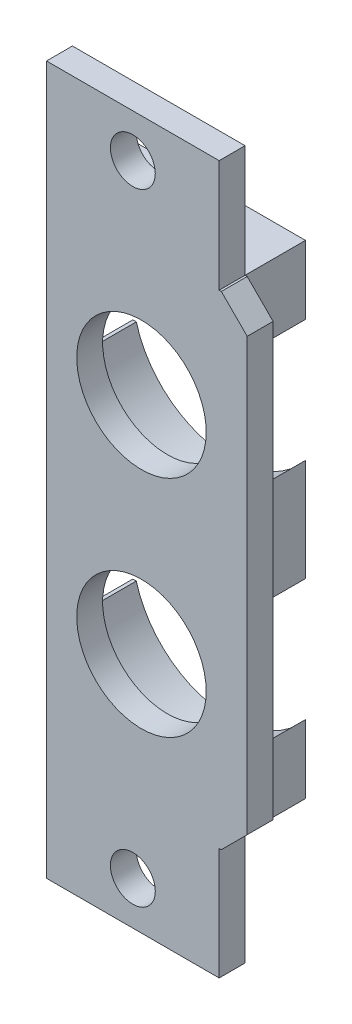
ISO-10303-21;
HEADER;
FILE_DESCRIPTION(('STEP AP214'),'2;1');
FILE_NAME('part.step','',(''),(''),'','','');
FILE_SCHEMA(('AUTOMOTIVE_DESIGN { 1 0 10303 214 1 1 1 1 }'));
ENDSEC;
DATA;
#1=APPLICATION_CONTEXT('core data for automotive mechanical design processes');
#2=APPLICATION_PROTOCOL_DEFINITION('international standard','automotive_design',2000,#1);
#3=PRODUCT_CONTEXT('',#1,'mechanical');
#4=PRODUCT('Part','Part','',(#3));
#5=PRODUCT_RELATED_PRODUCT_CATEGORY('part','',(#4));
#6=PRODUCT_DEFINITION_FORMATION('','',#4);
#7=PRODUCT_DEFINITION_CONTEXT('part definition',#1,'design');
#8=PRODUCT_DEFINITION('design','',#6,#7);
#9=PRODUCT_DEFINITION_SHAPE('','',#8);
#10=(LENGTH_UNIT() NAMED_UNIT(*) SI_UNIT(.MILLI.,.METRE.));
#11=(NAMED_UNIT(*) PLANE_ANGLE_UNIT() SI_UNIT($,.RADIAN.));
#12=(NAMED_UNIT(*) SI_UNIT($,.STERADIAN.) SOLID_ANGLE_UNIT());
#13=UNCERTAINTY_MEASURE_WITH_UNIT(LENGTH_MEASURE(1.E-05),#10,'distance_accuracy_value','');
#14=(GEOMETRIC_REPRESENTATION_CONTEXT(3) GLOBAL_UNCERTAINTY_ASSIGNED_CONTEXT((#13)) GLOBAL_UNIT_ASSIGNED_CONTEXT((#10,
#11,#12)) REPRESENTATION_CONTEXT('',''));
#15=CARTESIAN_POINT('',(0.,0.,0.));
#16=DIRECTION('',(0.,0.,1.));
#17=DIRECTION('',(1.,0.,0.));
#18=AXIS2_PLACEMENT_3D('',#15,#16,#17);
#19=CARTESIAN_POINT('',(10.,0.,-3.));
#20=DIRECTION('',(1.,0.,0.));
#21=DIRECTION('',(0.,0.,-1.));
#22=AXIS2_PLACEMENT_3D('',#19,#20,#21);
#23=PLANE('',#22);
#24=DIRECTION('',(0.,1.,0.));
#25=VECTOR('',#24,1.);
#26=CARTESIAN_POINT('',(10.,28.,-3.));
#27=LINE('',#26,#25);
#28=CARTESIAN_POINT('',(10.,-5.92893218813449,-3.));
#29=VERTEX_POINT('',#28);
#30=CARTESIAN_POINT('',(10.,5.92893218813454,-3.));
#31=VERTEX_POINT('',#30);
#32=EDGE_CURVE('E269',#29,#31,#27,.T.);
#33=ORIENTED_EDGE('',*,*,#32,.F.);
#34=DIRECTION('',(0.,0.,1.));
#35=VECTOR('',#34,1.);
#36=CARTESIAN_POINT('',(10.,-5.92893218813452,-45.322178059884));
#37=LINE('',#36,#35);
#38=CARTESIAN_POINT('',(10.,-5.92893218813452,-10.));
#39=VERTEX_POINT('',#38);
#40=EDGE_CURVE('E384',#39,#29,#37,.T.);
#41=ORIENTED_EDGE('',*,*,#40,.F.);
#42=DIRECTION('',(0.,1.,0.));
#43=VECTOR('',#42,1.);
#44=CARTESIAN_POINT('',(10.,0.,-10.));
#45=LINE('',#44,#43);
#46=CARTESIAN_POINT('',(9.99999999999999,5.92893218813453,-10.));
#47=VERTEX_POINT('',#46);
#48=EDGE_CURVE('E375',#39,#47,#45,.T.);
#49=ORIENTED_EDGE('',*,*,#48,.T.);
#50=DIRECTION('',(0.,0.,1.));
#51=VECTOR('',#50,1.);
#52=CARTESIAN_POINT('',(9.99999999999999,5.92893218813453,-45.322178059884));
#53=LINE('',#52,#51);
#54=EDGE_CURVE('E369',#47,#31,#53,.T.);
#55=ORIENTED_EDGE('',*,*,#54,.T.);
#56=EDGE_LOOP('',(#33,#41,#49,#55));
#57=FACE_BOUND('',#56,.T.);
#58=ADVANCED_FACE('F41',(#57),#23,.T.);
#59=CARTESIAN_POINT('',(9.99999999999999,-28.,-3.));
#60=VERTEX_POINT('',#59);
#61=CARTESIAN_POINT('',(10.,-20.0710678118654,-3.));
#62=VERTEX_POINT('',#61);
#63=EDGE_CURVE('E283',#60,#62,#27,.T.);
#64=ORIENTED_EDGE('',*,*,#63,.F.);
#65=DIRECTION('',(0.,0.,1.));
#66=VECTOR('',#65,1.);
#67=CARTESIAN_POINT('',(10.,-28.,-45.322178059884));
#68=LINE('',#67,#66);
#69=CARTESIAN_POINT('',(10.,-28.,-10.));
#70=VERTEX_POINT('',#69);
#71=EDGE_CURVE('E307',#70,#60,#68,.T.);
#72=ORIENTED_EDGE('',*,*,#71,.F.);
#73=DIRECTION('',(0.,1.,0.));
#74=VECTOR('',#73,1.);
#75=CARTESIAN_POINT('',(9.99999999999999,0.,-10.));
#76=LINE('',#75,#74);
#77=CARTESIAN_POINT('',(10.,-20.0710678118655,-10.));
#78=VERTEX_POINT('',#77);
#79=EDGE_CURVE('E298',#70,#78,#76,.T.);
#80=ORIENTED_EDGE('',*,*,#79,.T.);
#81=DIRECTION('',(0.,0.,1.));
#82=VECTOR('',#81,1.);
#83=CARTESIAN_POINT('',(10.,-20.0710678118655,-45.322178059884));
#84=LINE('',#83,#82);
#85=EDGE_CURVE('E296',#78,#62,#84,.T.);
#86=ORIENTED_EDGE('',*,*,#85,.T.);
#87=EDGE_LOOP('',(#64,#72,#80,#86));
#88=FACE_BOUND('',#87,.T.);
#89=ADVANCED_FACE('F504',(#88),#23,.T.);
#90=DIRECTION('',(0.,0.,-1.));
#91=VECTOR('',#90,1.);
#92=CARTESIAN_POINT('',(9.99999999999999,-28.,0.));
#93=LINE('',#92,#91);
#94=CARTESIAN_POINT('',(9.99999999999999,-28.,0.));
#95=VERTEX_POINT('',#94);
#96=EDGE_CURVE('E217',#95,#60,#93,.T.);
#97=ORIENTED_EDGE('',*,*,#96,.F.);
#98=DIRECTION('',(0.,1.,0.));
#99=VECTOR('',#98,1.);
#100=CARTESIAN_POINT('',(10.,0.,0.));
#101=LINE('',#100,#99);
#102=CARTESIAN_POINT('',(10.,-41.,0.));
#103=VERTEX_POINT('',#102);
#104=EDGE_CURVE('E234',#103,#95,#101,.T.);
#105=ORIENTED_EDGE('',*,*,#104,.F.);
#106=DIRECTION('',(0.,0.,1.));
#107=VECTOR('',#106,1.);
#108=CARTESIAN_POINT('',(10.,-41.,-3.));
#109=LINE('',#108,#107);
#110=CARTESIAN_POINT('',(10.,-41.,-3.));
#111=VERTEX_POINT('',#110);
#112=EDGE_CURVE('E259',#111,#103,#109,.T.);
#113=ORIENTED_EDGE('',*,*,#112,.F.);
#114=DIRECTION('',(0.,1.,0.));
#115=VECTOR('',#114,1.);
#116=CARTESIAN_POINT('',(10.,0.,-3.));
#117=LINE('',#116,#115);
#118=EDGE_CURVE('E421',#111,#60,#117,.T.);
#119=ORIENTED_EDGE('',*,*,#118,.T.);
#120=EDGE_LOOP('',(#97,#105,#113,#119));
#121=FACE_BOUND('',#120,.T.);
#122=ADVANCED_FACE('F509',(#121),#23,.T.);
#123=CARTESIAN_POINT('',(10.,28.,0.));
#124=VERTEX_POINT('',#123);
#125=CARTESIAN_POINT('',(10.,41.,0.));
#126=VERTEX_POINT('',#125);
#127=EDGE_CURVE('E224',#124,#126,#101,.T.);
#128=ORIENTED_EDGE('',*,*,#127,.F.);
#129=DIRECTION('',(0.,0.,-1.));
#130=VECTOR('',#129,1.);
#131=CARTESIAN_POINT('',(10.,28.,0.));
#132=LINE('',#131,#130);
#133=CARTESIAN_POINT('',(10.,28.,-3.));
#134=VERTEX_POINT('',#133);
#135=EDGE_CURVE('E206',#124,#134,#132,.T.);
#136=ORIENTED_EDGE('',*,*,#135,.T.);
#137=CARTESIAN_POINT('',(10.,41.,-3.));
#138=VERTEX_POINT('',#137);
#139=EDGE_CURVE('E420',#134,#138,#117,.T.);
#140=ORIENTED_EDGE('',*,*,#139,.T.);
#141=DIRECTION('',(0.,0.,1.));
#142=VECTOR('',#141,1.);
#143=CARTESIAN_POINT('',(10.,41.,-3.));
#144=LINE('',#143,#142);
#145=EDGE_CURVE('E232',#138,#126,#144,.T.);
#146=ORIENTED_EDGE('',*,*,#145,.T.);
#147=EDGE_LOOP('',(#128,#136,#140,#146));
#148=FACE_BOUND('',#147,.T.);
#149=ADVANCED_FACE('F230',(#148),#23,.T.);
#150=CARTESIAN_POINT('',(0.,0.,-3.));
#151=DIRECTION('',(0.,0.,1.));
#152=DIRECTION('',(1.,0.,0.));
#153=AXIS2_PLACEMENT_3D('',#150,#151,#152);
#154=PLANE('',#153);
#155=CARTESIAN_POINT('',(0.,36.,-3.));
#156=DIRECTION('',(0.,0.,1.));
#157=DIRECTION('',(1.,0.,0.));
#158=AXIS2_PLACEMENT_3D('',#155,#156,#157);
#159=CIRCLE('',#158,2.6);
#160=CARTESIAN_POINT('',(2.59999999999999,36.,-3.));
#161=VERTEX_POINT('',#160);
#162=EDGE_CURVE('E253',#161,#161,#159,.T.);
#163=ORIENTED_EDGE('',*,*,#162,.T.);
#164=EDGE_LOOP('',(#163));
#165=FACE_BOUND('',#164,.T.);
#166=DIRECTION('',(1.,0.,0.));
#167=VECTOR('',#166,1.);
#168=CARTESIAN_POINT('',(0.,28.,-3.));
#169=LINE('',#168,#167);
#170=CARTESIAN_POINT('',(-10.,28.,-3.));
#171=VERTEX_POINT('',#170);
#172=EDGE_CURVE('E362',#171,#134,#169,.T.);
#173=ORIENTED_EDGE('',*,*,#172,.F.);
#174=DIRECTION('',(0.,1.,0.));
#175=VECTOR('',#174,1.);
#176=CARTESIAN_POINT('',(-10.,0.,-3.));
#177=LINE('',#176,#175);
#178=CARTESIAN_POINT('',(-10.,41.,-3.));
#179=VERTEX_POINT('',#178);
#180=EDGE_CURVE('E412',#171,#179,#177,.T.);
#181=ORIENTED_EDGE('',*,*,#180,.T.);
#182=DIRECTION('',(1.,0.,0.));
#183=VECTOR('',#182,1.);
#184=CARTESIAN_POINT('',(0.,41.,-3.));
#185=LINE('',#184,#183);
#186=EDGE_CURVE('E424',#179,#138,#185,.T.);
#187=ORIENTED_EDGE('',*,*,#186,.T.);
#188=ORIENTED_EDGE('',*,*,#139,.F.);
#189=EDGE_LOOP('',(#173,#181,#187,#188));
#190=FACE_BOUND('',#189,.T.);
#191=ADVANCED_FACE('F449',(#165,#190),#154,.F.);
#192=CARTESIAN_POINT('',(0.999999999999998,13.,-3.));
#193=DIRECTION('',(0.,0.,1.));
#194=DIRECTION('',(1.,0.,0.));
#195=AXIS2_PLACEMENT_3D('',#192,#193,#194);
#196=CIRCLE('',#195,7.50000000000001);
#197=CARTESIAN_POINT('',(8.5,13.,-3.));
#198=VERTEX_POINT('',#197);
#199=EDGE_CURVE('E430',#198,#198,#196,.T.);
#200=ORIENTED_EDGE('',*,*,#199,.T.);
#201=EDGE_LOOP('',(#200));
#202=FACE_BOUND('',#201,.T.);
#203=DIRECTION('',(1.,0.,0.));
#204=VECTOR('',#203,1.);
#205=CARTESIAN_POINT('',(10.,28.,-3.));
#206=LINE('',#205,#204);
#207=CARTESIAN_POINT('',(10.25,28.,-3.));
#208=VERTEX_POINT('',#207);
#209=EDGE_CURVE('E212',#134,#208,#206,.T.);
#210=ORIENTED_EDGE('',*,*,#209,.T.);
#211=DIRECTION('',(-0.707106781186546,0.707106781186549,0.));
#212=VECTOR('',#211,1.);
#213=CARTESIAN_POINT('',(10.25,28.,-3.));
#214=LINE('',#213,#212);
#215=CARTESIAN_POINT('',(13.25,25.,-3.));
#216=VERTEX_POINT('',#215);
#217=EDGE_CURVE('E63',#208,#216,#214,.F.);
#218=ORIENTED_EDGE('',*,*,#217,.T.);
#219=DIRECTION('',(0.,-1.,0.));
#220=VECTOR('',#219,1.);
#221=CARTESIAN_POINT('',(13.25,28.,-3.));
#222=LINE('',#221,#220);
#223=CARTESIAN_POINT('',(13.25,-25.,-3.));
#224=VERTEX_POINT('',#223);
#225=EDGE_CURVE('E282',#216,#224,#222,.T.);
#226=ORIENTED_EDGE('',*,*,#225,.T.);
#227=DIRECTION('',(0.70710678118655,0.707106781186545,0.));
#228=VECTOR('',#227,1.);
#229=CARTESIAN_POINT('',(13.25,-25.,-3.));
#230=LINE('',#229,#228);
#231=CARTESIAN_POINT('',(10.25,-28.,-3.));
#232=VERTEX_POINT('',#231);
#233=EDGE_CURVE('E268',#224,#232,#230,.F.);
#234=ORIENTED_EDGE('',*,*,#233,.T.);
#235=DIRECTION('',(-1.,0.,0.));
#236=VECTOR('',#235,1.);
#237=CARTESIAN_POINT('',(9.99999999999999,-28.,-3.));
#238=LINE('',#237,#236);
#239=EDGE_CURVE('E228',#232,#60,#238,.T.);
#240=ORIENTED_EDGE('',*,*,#239,.T.);
#241=ORIENTED_EDGE('',*,*,#63,.T.);
#242=CARTESIAN_POINT('',(1.25,-13.,-3.));
#243=DIRECTION('',(0.,0.,1.));
#244=DIRECTION('',(1.,0.,0.));
#245=AXIS2_PLACEMENT_3D('',#242,#243,#244);
#246=CIRCLE('',#245,11.25);
#247=CARTESIAN_POINT('',(-9.6,-15.9732137494637,-3.));
#248=VERTEX_POINT('',#247);
#249=EDGE_CURVE('E324',#248,#62,#246,.T.);
#250=ORIENTED_EDGE('',*,*,#249,.F.);
#251=DIRECTION('',(-1.,0.,0.));
#252=VECTOR('',#251,1.);
#253=CARTESIAN_POINT('',(0.,-15.9732137494637,-3.));
#254=LINE('',#253,#252);
#255=CARTESIAN_POINT('',(-10.,-15.9732137494637,-3.));
#256=VERTEX_POINT('',#255);
#257=EDGE_CURVE('E318',#248,#256,#254,.T.);
#258=ORIENTED_EDGE('',*,*,#257,.T.);
#259=CARTESIAN_POINT('',(-10.,-10.0267862505363,-3.));
#260=VERTEX_POINT('',#259);
#261=EDGE_CURVE('E417',#256,#260,#177,.T.);
#262=ORIENTED_EDGE('',*,*,#261,.T.);
#263=DIRECTION('',(-1.,0.,0.));
#264=VECTOR('',#263,1.);
#265=CARTESIAN_POINT('',(0.,-10.0267862505363,-3.));
#266=LINE('',#265,#264);
#267=CARTESIAN_POINT('',(-9.6,-10.0267862505363,-3.));
#268=VERTEX_POINT('',#267);
#269=EDGE_CURVE('E401',#268,#260,#266,.T.);
#270=ORIENTED_EDGE('',*,*,#269,.F.);
#271=CARTESIAN_POINT('',(1.25,-13.,-3.));
#272=DIRECTION('',(0.,0.,1.));
#273=DIRECTION('',(1.,0.,0.));
#274=AXIS2_PLACEMENT_3D('',#271,#272,#273);
#275=CIRCLE('',#274,11.25);
#276=EDGE_CURVE('E404',#29,#268,#275,.T.);
#277=ORIENTED_EDGE('',*,*,#276,.F.);
#278=ORIENTED_EDGE('',*,*,#32,.T.);
#279=CARTESIAN_POINT('',(1.24999999999999,13.,-3.));
#280=DIRECTION('',(0.,0.,1.));
#281=DIRECTION('',(1.,0.,0.));
#282=AXIS2_PLACEMENT_3D('',#279,#280,#281);
#283=CIRCLE('',#282,11.25);
#284=CARTESIAN_POINT('',(-9.60000000000001,10.0267862505363,-3.));
#285=VERTEX_POINT('',#284);
#286=EDGE_CURVE('E406',#285,#31,#283,.T.);
#287=ORIENTED_EDGE('',*,*,#286,.F.);
#288=DIRECTION('',(-1.,0.,0.));
#289=VECTOR('',#288,1.);
#290=CARTESIAN_POINT('',(0.,10.0267862505363,-3.));
#291=LINE('',#290,#289);
#292=CARTESIAN_POINT('',(-10.,10.0267862505363,-3.));
#293=VERTEX_POINT('',#292);
#294=EDGE_CURVE('E398',#285,#293,#291,.T.);
#295=ORIENTED_EDGE('',*,*,#294,.T.);
#296=CARTESIAN_POINT('',(-10.,15.9732137494637,-3.));
#297=VERTEX_POINT('',#296);
#298=EDGE_CURVE('E418',#293,#297,#177,.T.);
#299=ORIENTED_EDGE('',*,*,#298,.T.);
#300=DIRECTION('',(-1.,0.,0.));
#301=VECTOR('',#300,1.);
#302=CARTESIAN_POINT('',(0.,15.9732137494637,-3.));
#303=LINE('',#302,#301);
#304=CARTESIAN_POINT('',(-9.60000000000001,15.9732137494637,-3.));
#305=VERTEX_POINT('',#304);
#306=EDGE_CURVE('E359',#305,#297,#303,.T.);
#307=ORIENTED_EDGE('',*,*,#306,.F.);
#308=CARTESIAN_POINT('',(1.24999999999999,13.,-3.));
#309=DIRECTION('',(0.,0.,1.));
#310=DIRECTION('',(1.,0.,0.));
#311=AXIS2_PLACEMENT_3D('',#308,#309,#310);
#312=CIRCLE('',#311,11.25);
#313=CARTESIAN_POINT('',(10.,20.0710678118655,-3.));
#314=VERTEX_POINT('',#313);
#315=EDGE_CURVE('E340',#314,#305,#312,.T.);
#316=ORIENTED_EDGE('',*,*,#315,.F.);
#317=EDGE_CURVE('E257',#314,#134,#27,.T.);
#318=ORIENTED_EDGE('',*,*,#317,.T.);
#319=EDGE_LOOP('',(#210,#218,#226,#234,#240,#241,#250,#258,#262,#270,#277,#278,#287,#295,#299,
#307,#316,#318));
#320=FACE_BOUND('',#319,.T.);
#321=CARTESIAN_POINT('',(0.999999999999998,-13.,-3.));
#322=DIRECTION('',(0.,0.,1.));
#323=DIRECTION('',(1.,0.,0.));
#324=AXIS2_PLACEMENT_3D('',#321,#322,#323);
#325=CIRCLE('',#324,7.49999999999999);
#326=CARTESIAN_POINT('',(8.49999999999999,-13.,-3.));
#327=VERTEX_POINT('',#326);
#328=EDGE_CURVE('E427',#327,#327,#325,.T.);
#329=ORIENTED_EDGE('',*,*,#328,.T.);
#330=EDGE_LOOP('',(#329));
#331=FACE_BOUND('',#330,.T.);
#332=ADVANCED_FACE('F279',(#202,#320,#331),#154,.F.);
#333=CARTESIAN_POINT('',(0.,-36.,-3.));
#334=DIRECTION('',(0.,0.,1.));
#335=DIRECTION('',(1.,0.,0.));
#336=AXIS2_PLACEMENT_3D('',#333,#334,#335);
#337=CIRCLE('',#336,2.6);
#338=CARTESIAN_POINT('',(2.6,-36.,-3.));
#339=VERTEX_POINT('',#338);
#340=EDGE_CURVE('E264',#339,#339,#337,.T.);
#341=ORIENTED_EDGE('',*,*,#340,.T.);
#342=EDGE_LOOP('',(#341));
#343=FACE_BOUND('',#342,.T.);
#344=CARTESIAN_POINT('',(-9.99999999999999,-41.,-3.));
#345=VERTEX_POINT('',#344);
#346=CARTESIAN_POINT('',(-10.,-28.,-3.));
#347=VERTEX_POINT('',#346);
#348=EDGE_CURVE('E413',#345,#347,#177,.T.);
#349=ORIENTED_EDGE('',*,*,#348,.T.);
#350=DIRECTION('',(1.,0.,0.));
#351=VECTOR('',#350,1.);
#352=CARTESIAN_POINT('',(0.,-28.,-3.));
#353=LINE('',#352,#351);
#354=EDGE_CURVE('E321',#347,#60,#353,.T.);
#355=ORIENTED_EDGE('',*,*,#354,.T.);
#356=ORIENTED_EDGE('',*,*,#118,.F.);
#357=DIRECTION('',(-1.,0.,0.));
#358=VECTOR('',#357,1.);
#359=CARTESIAN_POINT('',(0.,-41.,-3.));
#360=LINE('',#359,#358);
#361=EDGE_CURVE('E416',#111,#345,#360,.T.);
#362=ORIENTED_EDGE('',*,*,#361,.T.);
#363=EDGE_LOOP('',(#349,#355,#356,#362));
#364=FACE_BOUND('',#363,.T.);
#365=ADVANCED_FACE('F529',(#343,#364),#154,.F.);
#366=CARTESIAN_POINT('',(-10.,0.,-3.));
#367=DIRECTION('',(1.,0.,0.));
#368=DIRECTION('',(0.,0.,-1.));
#369=AXIS2_PLACEMENT_3D('',#366,#367,#368);
#370=PLANE('',#369);
#371=ORIENTED_EDGE('',*,*,#261,.F.);
#372=DIRECTION('',(0.,0.,1.));
#373=VECTOR('',#372,1.);
#374=CARTESIAN_POINT('',(-10.,-15.9732137494637,-45.322178059884));
#375=LINE('',#374,#373);
#376=CARTESIAN_POINT('',(-10.,-15.9732137494637,-10.));
#377=VERTEX_POINT('',#376);
#378=EDGE_CURVE('E313',#377,#256,#375,.T.);
#379=ORIENTED_EDGE('',*,*,#378,.F.);
#380=DIRECTION('',(0.,1.,0.));
#381=VECTOR('',#380,1.);
#382=CARTESIAN_POINT('',(-10.,0.,-10.));
#383=LINE('',#382,#381);
#384=CARTESIAN_POINT('',(-10.,-28.,-10.));
#385=VERTEX_POINT('',#384);
#386=EDGE_CURVE('E293',#385,#377,#383,.T.);
#387=ORIENTED_EDGE('',*,*,#386,.F.);
#388=DIRECTION('',(0.,0.,1.));
#389=VECTOR('',#388,1.);
#390=CARTESIAN_POINT('',(-10.,-28.,-45.322178059884));
#391=LINE('',#390,#389);
#392=EDGE_CURVE('E310',#385,#347,#391,.T.);
#393=ORIENTED_EDGE('',*,*,#392,.T.);
#394=ORIENTED_EDGE('',*,*,#348,.F.);
#395=DIRECTION('',(0.,0.,1.));
#396=VECTOR('',#395,1.);
#397=CARTESIAN_POINT('',(-9.99999999999999,-41.,-3.));
#398=LINE('',#397,#396);
#399=CARTESIAN_POINT('',(-9.99999999999999,-41.,0.));
#400=VERTEX_POINT('',#399);
#401=EDGE_CURVE('E261',#345,#400,#398,.T.);
#402=ORIENTED_EDGE('',*,*,#401,.T.);
#403=DIRECTION('',(0.,1.,0.));
#404=VECTOR('',#403,1.);
#405=CARTESIAN_POINT('',(-10.,0.,0.));
#406=LINE('',#405,#404);
#407=CARTESIAN_POINT('',(-10.,41.,0.));
#408=VERTEX_POINT('',#407);
#409=EDGE_CURVE('E239',#400,#408,#406,.T.);
#410=ORIENTED_EDGE('',*,*,#409,.T.);
#411=DIRECTION('',(0.,0.,1.));
#412=VECTOR('',#411,1.);
#413=CARTESIAN_POINT('',(-10.,41.,-3.));
#414=LINE('',#413,#412);
#415=EDGE_CURVE('E254',#179,#408,#414,.T.);
#416=ORIENTED_EDGE('',*,*,#415,.F.);
#417=ORIENTED_EDGE('',*,*,#180,.F.);
#418=DIRECTION('',(0.,0.,1.));
#419=VECTOR('',#418,1.);
#420=CARTESIAN_POINT('',(-10.,28.,-45.322178059884));
#421=LINE('',#420,#419);
#422=CARTESIAN_POINT('',(-10.,28.,-10.));
#423=VERTEX_POINT('',#422);
#424=EDGE_CURVE('E347',#423,#171,#421,.T.);
#425=ORIENTED_EDGE('',*,*,#424,.F.);
#426=DIRECTION('',(0.,1.,0.));
#427=VECTOR('',#426,1.);
#428=CARTESIAN_POINT('',(-10.,0.,-10.));
#429=LINE('',#428,#427);
#430=CARTESIAN_POINT('',(-10.,15.9732137494637,-10.));
#431=VERTEX_POINT('',#430);
#432=EDGE_CURVE('E331',#431,#423,#429,.T.);
#433=ORIENTED_EDGE('',*,*,#432,.F.);
#434=DIRECTION('',(0.,0.,1.));
#435=VECTOR('',#434,1.);
#436=CARTESIAN_POINT('',(-10.,15.9732137494637,-45.322178059884));
#437=LINE('',#436,#435);
#438=EDGE_CURVE('E344',#431,#297,#437,.T.);
#439=ORIENTED_EDGE('',*,*,#438,.T.);
#440=ORIENTED_EDGE('',*,*,#298,.F.);
#441=DIRECTION('',(0.,0.,1.));
#442=VECTOR('',#441,1.);
#443=CARTESIAN_POINT('',(-10.,10.0267862505363,-45.322178059884));
#444=LINE('',#443,#442);
#445=CARTESIAN_POINT('',(-10.,10.0267862505363,-10.));
#446=VERTEX_POINT('',#445);
#447=EDGE_CURVE('E393',#446,#293,#444,.T.);
#448=ORIENTED_EDGE('',*,*,#447,.F.);
#449=DIRECTION('',(0.,1.,0.));
#450=VECTOR('',#449,1.);
#451=CARTESIAN_POINT('',(-10.,0.,-10.));
#452=LINE('',#451,#450);
#453=CARTESIAN_POINT('',(-10.,-10.0267862505363,-10.));
#454=VERTEX_POINT('',#453);
#455=EDGE_CURVE('E366',#454,#446,#452,.T.);
#456=ORIENTED_EDGE('',*,*,#455,.F.);
#457=DIRECTION('',(0.,0.,1.));
#458=VECTOR('',#457,1.);
#459=CARTESIAN_POINT('',(-10.,-10.0267862505363,-45.322178059884));
#460=LINE('',#459,#458);
#461=EDGE_CURVE('E390',#454,#260,#460,.T.);
#462=ORIENTED_EDGE('',*,*,#461,.T.);
#463=EDGE_LOOP('',(#371,#379,#387,#393,#394,#402,#410,#416,#417,#425,#433,#439,#440,#448,#456,#462));
#464=FACE_BOUND('',#463,.T.);
#465=ADVANCED_FACE('F440',(#464),#370,.F.);
#466=CARTESIAN_POINT('',(0.,41.,-3.));
#467=DIRECTION('',(0.,-1.,0.));
#468=DIRECTION('',(0.,0.,-1.));
#469=AXIS2_PLACEMENT_3D('',#466,#467,#468);
#470=PLANE('',#469);
#471=DIRECTION('',(1.,0.,0.));
#472=VECTOR('',#471,1.);
#473=CARTESIAN_POINT('',(0.,41.,0.));
#474=LINE('',#473,#472);
#475=EDGE_CURVE('E238',#408,#126,#474,.T.);
#476=ORIENTED_EDGE('',*,*,#475,.T.);
#477=ORIENTED_EDGE('',*,*,#145,.F.);
#478=ORIENTED_EDGE('',*,*,#186,.F.);
#479=ORIENTED_EDGE('',*,*,#415,.T.);
#480=EDGE_LOOP('',(#476,#477,#478,#479));
#481=FACE_BOUND('',#480,.T.);
#482=ADVANCED_FACE('F447',(#481),#470,.F.);
#483=ORIENTED_EDGE('',*,*,#317,.F.);
#484=DIRECTION('',(0.,0.,1.));
#485=VECTOR('',#484,1.);
#486=CARTESIAN_POINT('',(10.,20.0710678118655,-45.322178059884));
#487=LINE('',#486,#485);
#488=CARTESIAN_POINT('',(10.,20.0710678118655,-10.));
#489=VERTEX_POINT('',#488);
#490=EDGE_CURVE('E327',#489,#314,#487,.T.);
#491=ORIENTED_EDGE('',*,*,#490,.F.);
#492=DIRECTION('',(0.,1.,0.));
#493=VECTOR('',#492,1.);
#494=CARTESIAN_POINT('',(10.,0.,-10.));
#495=LINE('',#494,#493);
#496=CARTESIAN_POINT('',(9.99999999999999,28.,-10.));
#497=VERTEX_POINT('',#496);
#498=EDGE_CURVE('E332',#489,#497,#495,.T.);
#499=ORIENTED_EDGE('',*,*,#498,.T.);
#500=DIRECTION('',(0.,0.,1.));
#501=VECTOR('',#500,1.);
#502=CARTESIAN_POINT('',(9.99999999999999,28.,-45.322178059884));
#503=LINE('',#502,#501);
#504=EDGE_CURVE('E350',#497,#134,#503,.T.);
#505=ORIENTED_EDGE('',*,*,#504,.T.);
#506=EDGE_LOOP('',(#483,#491,#499,#505));
#507=FACE_BOUND('',#506,.T.);
#508=ADVANCED_FACE('F485',(#507),#23,.T.);
#509=CARTESIAN_POINT('',(0.999999999999998,13.,-3.));
#510=DIRECTION('',(0.,0.,1.));
#511=DIRECTION('',(1.,0.,0.));
#512=AXIS2_PLACEMENT_3D('',#509,#510,#511);
#513=CYLINDRICAL_SURFACE('',#512,7.50000000000001);
#514=ORIENTED_EDGE('',*,*,#199,.F.);
#515=EDGE_LOOP('',(#514));
#516=FACE_BOUND('',#515,.T.);
#517=CARTESIAN_POINT('',(0.999999999999998,13.,0.));
#518=DIRECTION('',(0.,0.,1.));
#519=DIRECTION('',(1.,0.,0.));
#520=AXIS2_PLACEMENT_3D('',#517,#518,#519);
#521=CIRCLE('',#520,7.50000000000001);
#522=CARTESIAN_POINT('',(8.5,13.,0.));
#523=VERTEX_POINT('',#522);
#524=EDGE_CURVE('E247',#523,#523,#521,.T.);
#525=ORIENTED_EDGE('',*,*,#524,.T.);
#526=EDGE_LOOP('',(#525));
#527=FACE_BOUND('',#526,.T.);
#528=ADVANCED_FACE('F514',(#516,#527),#513,.F.);
#529=CARTESIAN_POINT('',(0.999999999999998,-13.,-3.));
#530=DIRECTION('',(0.,0.,1.));
#531=DIRECTION('',(1.,0.,0.));
#532=AXIS2_PLACEMENT_3D('',#529,#530,#531);
#533=CYLINDRICAL_SURFACE('',#532,7.49999999999999);
#534=ORIENTED_EDGE('',*,*,#328,.F.);
#535=EDGE_LOOP('',(#534));
#536=FACE_BOUND('',#535,.T.);
#537=CARTESIAN_POINT('',(0.999999999999998,-13.,0.));
#538=DIRECTION('',(0.,0.,1.));
#539=DIRECTION('',(1.,0.,0.));
#540=AXIS2_PLACEMENT_3D('',#537,#538,#539);
#541=CIRCLE('',#540,7.49999999999999);
#542=CARTESIAN_POINT('',(8.49999999999999,-13.,0.));
#543=VERTEX_POINT('',#542);
#544=EDGE_CURVE('E244',#543,#543,#541,.T.);
#545=ORIENTED_EDGE('',*,*,#544,.T.);
#546=EDGE_LOOP('',(#545));
#547=FACE_BOUND('',#546,.T.);
#548=ADVANCED_FACE('F519',(#536,#547),#533,.F.);
#549=CARTESIAN_POINT('',(0.,-41.,-3.));
#550=DIRECTION('',(0.,1.,0.));
#551=DIRECTION('',(0.,0.,1.));
#552=AXIS2_PLACEMENT_3D('',#549,#550,#551);
#553=PLANE('',#552);
#554=DIRECTION('',(-1.,0.,0.));
#555=VECTOR('',#554,1.);
#556=CARTESIAN_POINT('',(0.,-41.,0.));
#557=LINE('',#556,#555);
#558=EDGE_CURVE('E235',#103,#400,#557,.T.);
#559=ORIENTED_EDGE('',*,*,#558,.T.);
#560=ORIENTED_EDGE('',*,*,#401,.F.);
#561=ORIENTED_EDGE('',*,*,#361,.F.);
#562=ORIENTED_EDGE('',*,*,#112,.T.);
#563=EDGE_LOOP('',(#559,#560,#561,#562));
#564=FACE_BOUND('',#563,.T.);
#565=ADVANCED_FACE('F542',(#564),#553,.F.);
#566=CARTESIAN_POINT('',(0.,36.,-3.));
#567=DIRECTION('',(0.,0.,1.));
#568=DIRECTION('',(1.,0.,0.));
#569=AXIS2_PLACEMENT_3D('',#566,#567,#568);
#570=CYLINDRICAL_SURFACE('',#569,2.6);
#571=ORIENTED_EDGE('',*,*,#162,.F.);
#572=EDGE_LOOP('',(#571));
#573=FACE_BOUND('',#572,.T.);
#574=CARTESIAN_POINT('',(0.,36.,0.));
#575=DIRECTION('',(0.,0.,1.));
#576=DIRECTION('',(1.,0.,0.));
#577=AXIS2_PLACEMENT_3D('',#574,#575,#576);
#578=CIRCLE('',#577,2.6);
#579=CARTESIAN_POINT('',(2.59999999999999,36.,0.));
#580=VERTEX_POINT('',#579);
#581=EDGE_CURVE('E409',#580,#580,#578,.T.);
#582=ORIENTED_EDGE('',*,*,#581,.T.);
#583=EDGE_LOOP('',(#582));
#584=FACE_BOUND('',#583,.T.);
#585=ADVANCED_FACE('F588',(#573,#584),#570,.F.);
#586=CARTESIAN_POINT('',(0.,-36.,-3.));
#587=DIRECTION('',(0.,0.,1.));
#588=DIRECTION('',(1.,0.,0.));
#589=AXIS2_PLACEMENT_3D('',#586,#587,#588);
#590=CYLINDRICAL_SURFACE('',#589,2.6);
#591=ORIENTED_EDGE('',*,*,#340,.F.);
#592=EDGE_LOOP('',(#591));
#593=FACE_BOUND('',#592,.T.);
#594=CARTESIAN_POINT('',(0.,-36.,0.));
#595=DIRECTION('',(0.,0.,1.));
#596=DIRECTION('',(1.,0.,0.));
#597=AXIS2_PLACEMENT_3D('',#594,#595,#596);
#598=CIRCLE('',#597,2.6);
#599=CARTESIAN_POINT('',(2.6,-36.,0.));
#600=VERTEX_POINT('',#599);
#601=EDGE_CURVE('E250',#600,#600,#598,.T.);
#602=ORIENTED_EDGE('',*,*,#601,.T.);
#603=EDGE_LOOP('',(#602));
#604=FACE_BOUND('',#603,.T.);
#605=ADVANCED_FACE('F591',(#593,#604),#590,.F.);
#606=CARTESIAN_POINT('',(0.,0.,0.));
#607=DIRECTION('',(0.,0.,1.));
#608=DIRECTION('',(1.,0.,0.));
#609=AXIS2_PLACEMENT_3D('',#606,#607,#608);
#610=PLANE('',#609);
#611=DIRECTION('',(0.,-1.,0.));
#612=VECTOR('',#611,1.);
#613=CARTESIAN_POINT('',(13.25,28.,0.));
#614=LINE('',#613,#612);
#615=CARTESIAN_POINT('',(13.25,25.,0.));
#616=VERTEX_POINT('',#615);
#617=CARTESIAN_POINT('',(13.25,-25.,0.));
#618=VERTEX_POINT('',#617);
#619=EDGE_CURVE('E227',#616,#618,#614,.T.);
#620=ORIENTED_EDGE('',*,*,#619,.F.);
#621=DIRECTION('',(0.707106781186546,-0.707106781186549,0.));
#622=VECTOR('',#621,1.);
#623=CARTESIAN_POINT('',(19.125,19.1249999999999,0.));
#624=LINE('',#623,#622);
#625=CARTESIAN_POINT('',(10.25,28.,0.));
#626=VERTEX_POINT('',#625);
#627=EDGE_CURVE('E12',#616,#626,#624,.F.);
#628=ORIENTED_EDGE('',*,*,#627,.T.);
#629=DIRECTION('',(1.,0.,0.));
#630=VECTOR('',#629,1.);
#631=CARTESIAN_POINT('',(10.,28.,0.));
#632=LINE('',#631,#630);
#633=EDGE_CURVE('E210',#124,#626,#632,.T.);
#634=ORIENTED_EDGE('',*,*,#633,.F.);
#635=ORIENTED_EDGE('',*,*,#127,.T.);
#636=ORIENTED_EDGE('',*,*,#475,.F.);
#637=ORIENTED_EDGE('',*,*,#409,.F.);
#638=ORIENTED_EDGE('',*,*,#558,.F.);
#639=ORIENTED_EDGE('',*,*,#104,.T.);
#640=DIRECTION('',(-1.,0.,0.));
#641=VECTOR('',#640,1.);
#642=CARTESIAN_POINT('',(9.99999999999999,-28.,0.));
#643=LINE('',#642,#641);
#644=CARTESIAN_POINT('',(10.25,-28.,0.));
#645=VERTEX_POINT('',#644);
#646=EDGE_CURVE('E218',#645,#95,#643,.T.);
#647=ORIENTED_EDGE('',*,*,#646,.F.);
#648=DIRECTION('',(-0.70710678118655,-0.707106781186545,0.));
#649=VECTOR('',#648,1.);
#650=CARTESIAN_POINT('',(19.125,-19.1250000000001,0.));
#651=LINE('',#650,#649);
#652=EDGE_CURVE('E273',#645,#618,#651,.F.);
#653=ORIENTED_EDGE('',*,*,#652,.T.);
#654=EDGE_LOOP('',(#620,#628,#634,#635,#636,#637,#638,#639,#647,#653));
#655=FACE_BOUND('',#654,.T.);
#656=ORIENTED_EDGE('',*,*,#601,.F.);
#657=EDGE_LOOP('',(#656));
#658=FACE_BOUND('',#657,.T.);
#659=ORIENTED_EDGE('',*,*,#581,.F.);
#660=EDGE_LOOP('',(#659));
#661=FACE_BOUND('',#660,.T.);
#662=ORIENTED_EDGE('',*,*,#524,.F.);
#663=EDGE_LOOP('',(#662));
#664=FACE_BOUND('',#663,.T.);
#665=ORIENTED_EDGE('',*,*,#544,.F.);
#666=EDGE_LOOP('',(#665));
#667=FACE_BOUND('',#666,.T.);
#668=ADVANCED_FACE('F221',(#655,#658,#661,#664,#667),#610,.T.);
#669=CARTESIAN_POINT('',(1.24999999999999,13.,-45.322178059884));
#670=DIRECTION('',(0.,0.,1.));
#671=DIRECTION('',(1.,0.,0.));
#672=AXIS2_PLACEMENT_3D('',#669,#670,#671);
#673=CYLINDRICAL_SURFACE('',#672,11.25);
#674=DIRECTION('',(0.,0.,1.));
#675=VECTOR('',#674,1.);
#676=CARTESIAN_POINT('',(-9.60000000000001,10.0267862505363,-45.322178059884));
#677=LINE('',#676,#675);
#678=CARTESIAN_POINT('',(-9.60000000000001,10.0267862505363,-10.));
#679=VERTEX_POINT('',#678);
#680=EDGE_CURVE('E365',#679,#285,#677,.T.);
#681=ORIENTED_EDGE('',*,*,#680,.T.);
#682=ORIENTED_EDGE('',*,*,#286,.T.);
#683=ORIENTED_EDGE('',*,*,#54,.F.);
#684=CARTESIAN_POINT('',(1.24999999999999,13.,-10.));
#685=DIRECTION('',(0.,0.,1.));
#686=DIRECTION('',(1.,0.,0.));
#687=AXIS2_PLACEMENT_3D('',#684,#685,#686);
#688=CIRCLE('',#687,11.25);
#689=EDGE_CURVE('E378',#47,#679,#688,.F.);
#690=ORIENTED_EDGE('',*,*,#689,.T.);
#691=EDGE_LOOP('',(#681,#682,#683,#690));
#692=FACE_BOUND('',#691,.T.);
#693=ADVANCED_FACE('F472',(#692),#673,.F.);
#694=CARTESIAN_POINT('',(1.25,-13.,-45.322178059884));
#695=DIRECTION('',(0.,0.,1.));
#696=DIRECTION('',(1.,0.,0.));
#697=AXIS2_PLACEMENT_3D('',#694,#695,#696);
#698=CYLINDRICAL_SURFACE('',#697,11.25);
#699=ORIENTED_EDGE('',*,*,#40,.T.);
#700=ORIENTED_EDGE('',*,*,#276,.T.);
#701=DIRECTION('',(0.,0.,1.));
#702=VECTOR('',#701,1.);
#703=CARTESIAN_POINT('',(-9.6,-10.0267862505363,-45.322178059884));
#704=LINE('',#703,#702);
#705=CARTESIAN_POINT('',(-9.6,-10.0267862505363,-10.));
#706=VERTEX_POINT('',#705);
#707=EDGE_CURVE('E387',#706,#268,#704,.T.);
#708=ORIENTED_EDGE('',*,*,#707,.F.);
#709=CARTESIAN_POINT('',(1.25,-13.,-10.));
#710=DIRECTION('',(0.,0.,1.));
#711=DIRECTION('',(1.,0.,0.));
#712=AXIS2_PLACEMENT_3D('',#709,#710,#711);
#713=CIRCLE('',#712,11.25);
#714=EDGE_CURVE('E372',#706,#39,#713,.F.);
#715=ORIENTED_EDGE('',*,*,#714,.T.);
#716=EDGE_LOOP('',(#699,#700,#708,#715));
#717=FACE_BOUND('',#716,.T.);
#718=ADVANCED_FACE('F466',(#717),#698,.F.);
#719=CARTESIAN_POINT('',(0.,-10.0267862505363,-45.322178059884));
#720=DIRECTION('',(0.,1.,0.));
#721=DIRECTION('',(0.,0.,1.));
#722=AXIS2_PLACEMENT_3D('',#719,#720,#721);
#723=PLANE('',#722);
#724=ORIENTED_EDGE('',*,*,#707,.T.);
#725=ORIENTED_EDGE('',*,*,#269,.T.);
#726=ORIENTED_EDGE('',*,*,#461,.F.);
#727=DIRECTION('',(1.,0.,0.));
#728=VECTOR('',#727,1.);
#729=CARTESIAN_POINT('',(0.,-10.0267862505363,-10.));
#730=LINE('',#729,#728);
#731=EDGE_CURVE('E368',#454,#706,#730,.T.);
#732=ORIENTED_EDGE('',*,*,#731,.T.);
#733=EDGE_LOOP('',(#724,#725,#726,#732));
#734=FACE_BOUND('',#733,.T.);
#735=ADVANCED_FACE('F457',(#734),#723,.F.);
#736=CARTESIAN_POINT('',(0.,10.0267862505363,-45.322178059884));
#737=DIRECTION('',(0.,1.,0.));
#738=DIRECTION('',(0.,0.,1.));
#739=AXIS2_PLACEMENT_3D('',#736,#737,#738);
#740=PLANE('',#739);
#741=ORIENTED_EDGE('',*,*,#294,.F.);
#742=ORIENTED_EDGE('',*,*,#680,.F.);
#743=DIRECTION('',(1.,0.,0.));
#744=VECTOR('',#743,1.);
#745=CARTESIAN_POINT('',(0.,10.0267862505363,-10.));
#746=LINE('',#745,#744);
#747=EDGE_CURVE('E381',#446,#679,#746,.T.);
#748=ORIENTED_EDGE('',*,*,#747,.F.);
#749=ORIENTED_EDGE('',*,*,#447,.T.);
#750=EDGE_LOOP('',(#741,#742,#748,#749));
#751=FACE_BOUND('',#750,.T.);
#752=ADVANCED_FACE('F475',(#751),#740,.T.);
#753=CARTESIAN_POINT('',(0.,0.,-10.));
#754=DIRECTION('',(0.,0.,1.));
#755=DIRECTION('',(1.,0.,0.));
#756=AXIS2_PLACEMENT_3D('',#753,#754,#755);
#757=PLANE('',#756);
#758=ORIENTED_EDGE('',*,*,#48,.F.);
#759=ORIENTED_EDGE('',*,*,#714,.F.);
#760=ORIENTED_EDGE('',*,*,#731,.F.);
#761=ORIENTED_EDGE('',*,*,#455,.T.);
#762=ORIENTED_EDGE('',*,*,#747,.T.);
#763=ORIENTED_EDGE('',*,*,#689,.F.);
#764=EDGE_LOOP('',(#758,#759,#760,#761,#762,#763));
#765=FACE_BOUND('',#764,.T.);
#766=ADVANCED_FACE('F464',(#765),#757,.F.);
#767=CARTESIAN_POINT('',(0.,28.,-45.322178059884));
#768=DIRECTION('',(0.,-1.,0.));
#769=DIRECTION('',(0.,0.,-1.));
#770=AXIS2_PLACEMENT_3D('',#767,#768,#769);
#771=PLANE('',#770);
#772=ORIENTED_EDGE('',*,*,#424,.T.);
#773=ORIENTED_EDGE('',*,*,#172,.T.);
#774=ORIENTED_EDGE('',*,*,#504,.F.);
#775=DIRECTION('',(-1.,0.,0.));
#776=VECTOR('',#775,1.);
#777=CARTESIAN_POINT('',(0.,28.,-10.));
#778=LINE('',#777,#776);
#779=EDGE_CURVE('E328',#497,#423,#778,.T.);
#780=ORIENTED_EDGE('',*,*,#779,.T.);
#781=EDGE_LOOP('',(#772,#773,#774,#780));
#782=FACE_BOUND('',#781,.T.);
#783=ADVANCED_FACE('F488',(#782),#771,.F.);
#784=CARTESIAN_POINT('',(0.,15.9732137494637,-45.322178059884));
#785=DIRECTION('',(0.,1.,0.));
#786=DIRECTION('',(0.,0.,1.));
#787=AXIS2_PLACEMENT_3D('',#784,#785,#786);
#788=PLANE('',#787);
#789=DIRECTION('',(0.,0.,1.));
#790=VECTOR('',#789,1.);
#791=CARTESIAN_POINT('',(-9.60000000000001,15.9732137494637,-45.322178059884));
#792=LINE('',#791,#790);
#793=CARTESIAN_POINT('',(-9.60000000000001,15.9732137494637,-10.));
#794=VERTEX_POINT('',#793);
#795=EDGE_CURVE('E341',#794,#305,#792,.T.);
#796=ORIENTED_EDGE('',*,*,#795,.T.);
#797=ORIENTED_EDGE('',*,*,#306,.T.);
#798=ORIENTED_EDGE('',*,*,#438,.F.);
#799=DIRECTION('',(1.,0.,0.));
#800=VECTOR('',#799,1.);
#801=CARTESIAN_POINT('',(0.,15.9732137494637,-10.));
#802=LINE('',#801,#800);
#803=EDGE_CURVE('E334',#431,#794,#802,.T.);
#804=ORIENTED_EDGE('',*,*,#803,.T.);
#805=EDGE_LOOP('',(#796,#797,#798,#804));
#806=FACE_BOUND('',#805,.T.);
#807=ADVANCED_FACE('F479',(#806),#788,.F.);
#808=CARTESIAN_POINT('',(1.24999999999999,13.,-45.322178059884));
#809=DIRECTION('',(0.,0.,1.));
#810=DIRECTION('',(1.,0.,0.));
#811=AXIS2_PLACEMENT_3D('',#808,#809,#810);
#812=CYLINDRICAL_SURFACE('',#811,11.25);
#813=ORIENTED_EDGE('',*,*,#490,.T.);
#814=ORIENTED_EDGE('',*,*,#315,.T.);
#815=ORIENTED_EDGE('',*,*,#795,.F.);
#816=CARTESIAN_POINT('',(1.24999999999999,13.,-10.));
#817=DIRECTION('',(0.,0.,1.));
#818=DIRECTION('',(1.,0.,0.));
#819=AXIS2_PLACEMENT_3D('',#816,#817,#818);
#820=CIRCLE('',#819,11.25);
#821=EDGE_CURVE('E337',#794,#489,#820,.F.);
#822=ORIENTED_EDGE('',*,*,#821,.T.);
#823=EDGE_LOOP('',(#813,#814,#815,#822));
#824=FACE_BOUND('',#823,.T.);
#825=ADVANCED_FACE('F482',(#824),#812,.F.);
#826=CARTESIAN_POINT('',(0.,0.,-10.));
#827=DIRECTION('',(0.,0.,1.));
#828=DIRECTION('',(1.,0.,0.));
#829=AXIS2_PLACEMENT_3D('',#826,#827,#828);
#830=PLANE('',#829);
#831=ORIENTED_EDGE('',*,*,#803,.F.);
#832=ORIENTED_EDGE('',*,*,#432,.T.);
#833=ORIENTED_EDGE('',*,*,#779,.F.);
#834=ORIENTED_EDGE('',*,*,#498,.F.);
#835=ORIENTED_EDGE('',*,*,#821,.F.);
#836=EDGE_LOOP('',(#831,#832,#833,#834,#835));
#837=FACE_BOUND('',#836,.T.);
#838=ADVANCED_FACE('F490',(#837),#830,.F.);
#839=CARTESIAN_POINT('',(1.25,-13.,-45.322178059884));
#840=DIRECTION('',(0.,0.,1.));
#841=DIRECTION('',(1.,0.,0.));
#842=AXIS2_PLACEMENT_3D('',#839,#840,#841);
#843=CYLINDRICAL_SURFACE('',#842,11.25);
#844=DIRECTION('',(0.,0.,1.));
#845=VECTOR('',#844,1.);
#846=CARTESIAN_POINT('',(-9.6,-15.9732137494637,-45.322178059884));
#847=LINE('',#846,#845);
#848=CARTESIAN_POINT('',(-9.6,-15.9732137494637,-10.));
#849=VERTEX_POINT('',#848);
#850=EDGE_CURVE('E291',#849,#248,#847,.T.);
#851=ORIENTED_EDGE('',*,*,#850,.T.);
#852=ORIENTED_EDGE('',*,*,#249,.T.);
#853=ORIENTED_EDGE('',*,*,#85,.F.);
#854=CARTESIAN_POINT('',(1.25,-13.,-10.));
#855=DIRECTION('',(0.,0.,1.));
#856=DIRECTION('',(1.,0.,0.));
#857=AXIS2_PLACEMENT_3D('',#854,#855,#856);
#858=CIRCLE('',#857,11.25);
#859=EDGE_CURVE('E301',#78,#849,#858,.F.);
#860=ORIENTED_EDGE('',*,*,#859,.T.);
#861=EDGE_LOOP('',(#851,#852,#853,#860));
#862=FACE_BOUND('',#861,.T.);
#863=ADVANCED_FACE('F492',(#862),#843,.F.);
#864=CARTESIAN_POINT('',(0.,-28.,-45.322178059884));
#865=DIRECTION('',(0.,-1.,0.));
#866=DIRECTION('',(0.,0.,-1.));
#867=AXIS2_PLACEMENT_3D('',#864,#865,#866);
#868=PLANE('',#867);
#869=ORIENTED_EDGE('',*,*,#354,.F.);
#870=ORIENTED_EDGE('',*,*,#392,.F.);
#871=DIRECTION('',(-1.,0.,0.));
#872=VECTOR('',#871,1.);
#873=CARTESIAN_POINT('',(0.,-28.,-10.));
#874=LINE('',#873,#872);
#875=EDGE_CURVE('E295',#70,#385,#874,.T.);
#876=ORIENTED_EDGE('',*,*,#875,.F.);
#877=ORIENTED_EDGE('',*,*,#71,.T.);
#878=EDGE_LOOP('',(#869,#870,#876,#877));
#879=FACE_BOUND('',#878,.T.);
#880=ADVANCED_FACE('F498',(#879),#868,.T.);
#881=CARTESIAN_POINT('',(0.,-15.9732137494637,-45.322178059884));
#882=DIRECTION('',(0.,1.,0.));
#883=DIRECTION('',(0.,0.,1.));
#884=AXIS2_PLACEMENT_3D('',#881,#882,#883);
#885=PLANE('',#884);
#886=ORIENTED_EDGE('',*,*,#257,.F.);
#887=ORIENTED_EDGE('',*,*,#850,.F.);
#888=DIRECTION('',(1.,0.,0.));
#889=VECTOR('',#888,1.);
#890=CARTESIAN_POINT('',(0.,-15.9732137494637,-10.));
#891=LINE('',#890,#889);
#892=EDGE_CURVE('E304',#377,#849,#891,.T.);
#893=ORIENTED_EDGE('',*,*,#892,.F.);
#894=ORIENTED_EDGE('',*,*,#378,.T.);
#895=EDGE_LOOP('',(#886,#887,#893,#894));
#896=FACE_BOUND('',#895,.T.);
#897=ADVANCED_FACE('F556',(#896),#885,.T.);
#898=CARTESIAN_POINT('',(0.,0.,-10.));
#899=DIRECTION('',(0.,0.,1.));
#900=DIRECTION('',(1.,0.,0.));
#901=AXIS2_PLACEMENT_3D('',#898,#899,#900);
#902=PLANE('',#901);
#903=ORIENTED_EDGE('',*,*,#79,.F.);
#904=ORIENTED_EDGE('',*,*,#875,.T.);
#905=ORIENTED_EDGE('',*,*,#386,.T.);
#906=ORIENTED_EDGE('',*,*,#892,.T.);
#907=ORIENTED_EDGE('',*,*,#859,.F.);
#908=EDGE_LOOP('',(#903,#904,#905,#906,#907));
#909=FACE_BOUND('',#908,.T.);
#910=ADVANCED_FACE('F552',(#909),#902,.F.);
#911=CARTESIAN_POINT('',(9.99999999999999,-28.,0.));
#912=DIRECTION('',(0.,-1.,0.));
#913=DIRECTION('',(0.,0.,-1.));
#914=AXIS2_PLACEMENT_3D('',#911,#912,#913);
#915=PLANE('',#914);
#916=ORIENTED_EDGE('',*,*,#239,.F.);
#917=DIRECTION('',(0.,0.,1.));
#918=VECTOR('',#917,1.);
#919=CARTESIAN_POINT('',(10.25,-28.,0.));
#920=LINE('',#919,#918);
#921=EDGE_CURVE('E271',#232,#645,#920,.T.);
#922=ORIENTED_EDGE('',*,*,#921,.T.);
#923=ORIENTED_EDGE('',*,*,#646,.T.);
#924=ORIENTED_EDGE('',*,*,#96,.T.);
#925=EDGE_LOOP('',(#916,#922,#923,#924));
#926=FACE_BOUND('',#925,.T.);
#927=ADVANCED_FACE('F563',(#926),#915,.T.);
#928=CARTESIAN_POINT('',(13.25,28.,0.));
#929=DIRECTION('',(1.,0.,0.));
#930=DIRECTION('',(0.,1.,0.));
#931=AXIS2_PLACEMENT_3D('',#928,#929,#930);
#932=PLANE('',#931);
#933=ORIENTED_EDGE('',*,*,#225,.F.);
#934=DIRECTION('',(0.,0.,1.));
#935=VECTOR('',#934,1.);
#936=CARTESIAN_POINT('',(13.25,25.,0.));
#937=LINE('',#936,#935);
#938=EDGE_CURVE('E49',#216,#616,#937,.T.);
#939=ORIENTED_EDGE('',*,*,#938,.T.);
#940=ORIENTED_EDGE('',*,*,#619,.T.);
#941=DIRECTION('',(0.,0.,-1.));
#942=VECTOR('',#941,1.);
#943=CARTESIAN_POINT('',(13.25,-25.,0.));
#944=LINE('',#943,#942);
#945=EDGE_CURVE('E265',#618,#224,#944,.T.);
#946=ORIENTED_EDGE('',*,*,#945,.T.);
#947=EDGE_LOOP('',(#933,#939,#940,#946));
#948=FACE_BOUND('',#947,.T.);
#949=ADVANCED_FACE('F570',(#948),#932,.T.);
#950=CARTESIAN_POINT('',(10.,28.,0.));
#951=DIRECTION('',(0.,1.,0.));
#952=DIRECTION('',(0.,0.,1.));
#953=AXIS2_PLACEMENT_3D('',#950,#951,#952);
#954=PLANE('',#953);
#955=ORIENTED_EDGE('',*,*,#633,.T.);
#956=DIRECTION('',(0.,0.,-1.));
#957=VECTOR('',#956,1.);
#958=CARTESIAN_POINT('',(10.25,28.,0.));
#959=LINE('',#958,#957);
#960=EDGE_CURVE('E276',#626,#208,#959,.T.);
#961=ORIENTED_EDGE('',*,*,#960,.T.);
#962=ORIENTED_EDGE('',*,*,#209,.F.);
#963=ORIENTED_EDGE('',*,*,#135,.F.);
#964=EDGE_LOOP('',(#955,#961,#962,#963));
#965=FACE_BOUND('',#964,.T.);
#966=ADVANCED_FACE('F208',(#965),#954,.T.);
#967=CARTESIAN_POINT('',(13.25,-25.,0.));
#968=DIRECTION('',(-0.707106781186545,0.70710678118655,0.));
#969=DIRECTION('',(0.,0.,-1.));
#970=AXIS2_PLACEMENT_3D('',#967,#968,#969);
#971=PLANE('',#970);
#972=ORIENTED_EDGE('',*,*,#652,.F.);
#973=ORIENTED_EDGE('',*,*,#921,.F.);
#974=ORIENTED_EDGE('',*,*,#233,.F.);
#975=ORIENTED_EDGE('',*,*,#945,.F.);
#976=EDGE_LOOP('',(#972,#973,#974,#975));
#977=FACE_BOUND('',#976,.T.);
#978=ADVANCED_FACE('F569',(#977),#971,.F.);
#979=CARTESIAN_POINT('',(10.25,28.,0.));
#980=DIRECTION('',(-0.707106781186549,-0.707106781186546,0.));
#981=DIRECTION('',(0.,0.,-1.));
#982=AXIS2_PLACEMENT_3D('',#979,#980,#981);
#983=PLANE('',#982);
#984=ORIENTED_EDGE('',*,*,#627,.F.);
#985=ORIENTED_EDGE('',*,*,#938,.F.);
#986=ORIENTED_EDGE('',*,*,#217,.F.);
#987=ORIENTED_EDGE('',*,*,#960,.F.);
#988=EDGE_LOOP('',(#984,#985,#986,#987));
#989=FACE_BOUND('',#988,.T.);
#990=ADVANCED_FACE('F43',(#989),#983,.F.);
#991=CLOSED_SHELL('',(#58,#89,#122,#149,#191,#332,#365,#465,#482,#508,#528,#548,#565,#585,#605,
#668,#693,#718,#735,#752,#766,#783,#807,#825,#838,#863,#880,#897,#910,#927,#949,#966,#978,#990));
#992=MANIFOLD_SOLID_BREP('B2',#991);
#993=ADVANCED_BREP_SHAPE_REPRESENTATION('',(#18,#992),#14);
#994=SHAPE_DEFINITION_REPRESENTATION(#9,#993);
ENDSEC;
END-ISO-10303-21;
